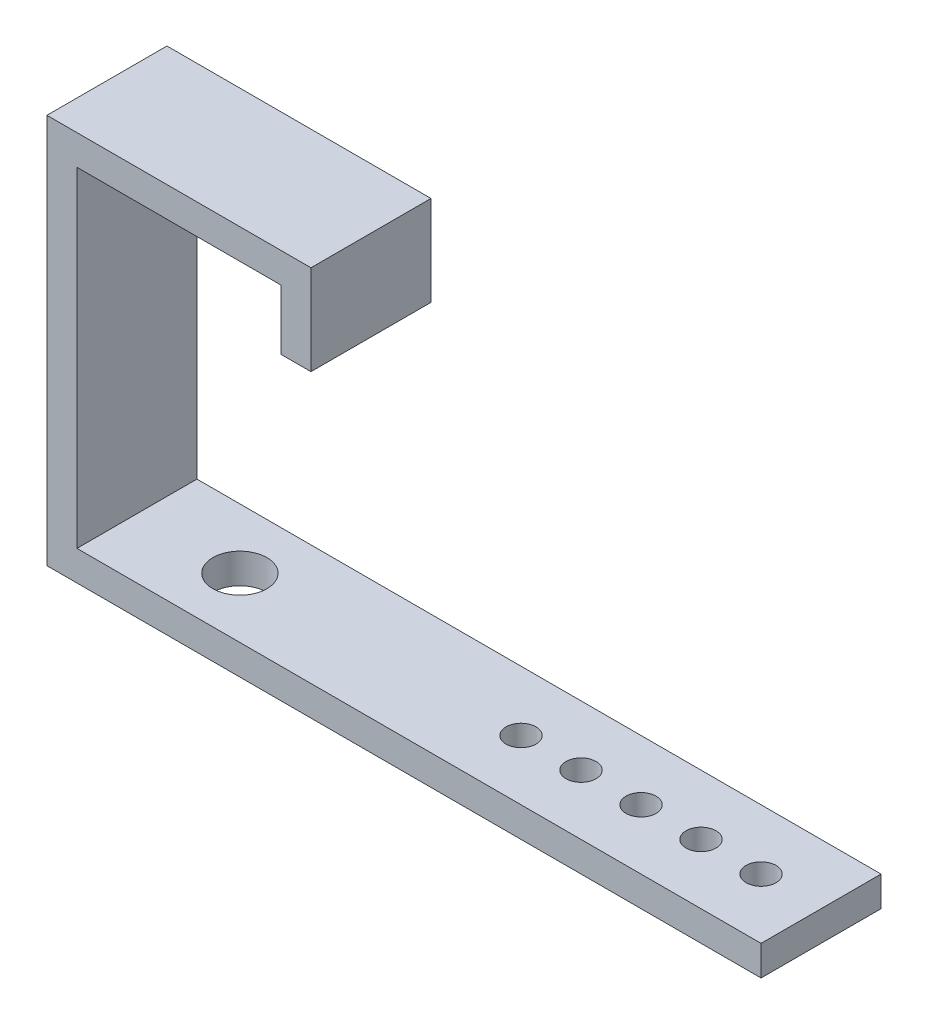
ISO-10303-21;
HEADER;
FILE_DESCRIPTION(('STEP AP214'),'2;1');
FILE_NAME('part.step','',(''),(''),'','','');
FILE_SCHEMA(('AUTOMOTIVE_DESIGN { 1 0 10303 214 1 1 1 1 }'));
ENDSEC;
DATA;
#1=APPLICATION_CONTEXT('core data for automotive mechanical design processes');
#2=APPLICATION_PROTOCOL_DEFINITION('international standard','automotive_design',2000,#1);
#3=PRODUCT_CONTEXT('',#1,'mechanical');
#4=PRODUCT('Part','Part','',(#3));
#5=PRODUCT_RELATED_PRODUCT_CATEGORY('part','',(#4));
#6=PRODUCT_DEFINITION_FORMATION('','',#4);
#7=PRODUCT_DEFINITION_CONTEXT('part definition',#1,'design');
#8=PRODUCT_DEFINITION('design','',#6,#7);
#9=PRODUCT_DEFINITION_SHAPE('','',#8);
#10=(LENGTH_UNIT() NAMED_UNIT(*) SI_UNIT(.MILLI.,.METRE.));
#11=(NAMED_UNIT(*) PLANE_ANGLE_UNIT() SI_UNIT($,.RADIAN.));
#12=(NAMED_UNIT(*) SI_UNIT($,.STERADIAN.) SOLID_ANGLE_UNIT());
#13=UNCERTAINTY_MEASURE_WITH_UNIT(LENGTH_MEASURE(1.E-05),#10,'distance_accuracy_value','');
#14=(GEOMETRIC_REPRESENTATION_CONTEXT(3) GLOBAL_UNCERTAINTY_ASSIGNED_CONTEXT((#13)) GLOBAL_UNIT_ASSIGNED_CONTEXT((#10,
#11,#12)) REPRESENTATION_CONTEXT('',''));
#15=CARTESIAN_POINT('',(0.,0.,0.));
#16=DIRECTION('',(0.,0.,1.));
#17=DIRECTION('',(1.,0.,0.));
#18=AXIS2_PLACEMENT_3D('',#15,#16,#17);
#19=CARTESIAN_POINT('',(0.,25.1525882715006,20.));
#20=DIRECTION('',(0.,-1.,0.));
#21=DIRECTION('',(1.,0.,0.));
#22=AXIS2_PLACEMENT_3D('',#19,#20,#21);
#23=PLANE('',#22);
#24=DIRECTION('',(-1.,0.,0.));
#25=VECTOR('',#24,1.);
#26=CARTESIAN_POINT('',(0.,25.1525882715006,0.));
#27=LINE('',#26,#25);
#28=CARTESIAN_POINT('',(17.6256228738895,25.1525882715006,0.));
#29=VERTEX_POINT('',#28);
#30=CARTESIAN_POINT('',(-26.3743771261105,25.1525882715006,0.));
#31=VERTEX_POINT('',#30);
#32=EDGE_CURVE('E133',#29,#31,#27,.T.);
#33=ORIENTED_EDGE('',*,*,#32,.T.);
#34=DIRECTION('',(0.,0.,-1.));
#35=VECTOR('',#34,1.);
#36=CARTESIAN_POINT('',(-26.3743771261105,25.1525882715006,20.));
#37=LINE('',#36,#35);
#38=CARTESIAN_POINT('',(-26.3743771261105,25.1525882715006,20.));
#39=VERTEX_POINT('',#38);
#40=EDGE_CURVE('E11',#39,#31,#37,.T.);
#41=ORIENTED_EDGE('',*,*,#40,.F.);
#42=DIRECTION('',(-1.,0.,0.));
#43=VECTOR('',#42,1.);
#44=CARTESIAN_POINT('',(0.,25.1525882715006,20.));
#45=LINE('',#44,#43);
#46=CARTESIAN_POINT('',(17.6256228738895,25.1525882715006,20.));
#47=VERTEX_POINT('',#46);
#48=EDGE_CURVE('E156',#47,#39,#45,.T.);
#49=ORIENTED_EDGE('',*,*,#48,.F.);
#50=DIRECTION('',(0.,0.,-1.));
#51=VECTOR('',#50,1.);
#52=CARTESIAN_POINT('',(17.6256228738895,25.1525882715006,20.));
#53=LINE('',#52,#51);
#54=EDGE_CURVE('E49',#47,#29,#53,.T.);
#55=ORIENTED_EDGE('',*,*,#54,.T.);
#56=EDGE_LOOP('',(#33,#41,#49,#55));
#57=FACE_BOUND('',#56,.T.);
#58=ADVANCED_FACE('F33',(#57),#23,.F.);
#59=CARTESIAN_POINT('',(-26.3743771261105,0.,20.));
#60=DIRECTION('',(1.,0.,0.));
#61=DIRECTION('',(0.,1.,0.));
#62=AXIS2_PLACEMENT_3D('',#59,#60,#61);
#63=PLANE('',#62);
#64=DIRECTION('',(0.,-1.,0.));
#65=VECTOR('',#64,1.);
#66=CARTESIAN_POINT('',(-26.3743771261105,0.,0.));
#67=LINE('',#66,#65);
#68=CARTESIAN_POINT('',(-26.3743771261105,-39.8474117284994,0.));
#69=VERTEX_POINT('',#68);
#70=EDGE_CURVE('E135',#31,#69,#67,.T.);
#71=ORIENTED_EDGE('',*,*,#70,.T.);
#72=DIRECTION('',(0.,0.,-1.));
#73=VECTOR('',#72,1.);
#74=CARTESIAN_POINT('',(-26.3743771261105,-39.8474117284994,20.));
#75=LINE('',#74,#73);
#76=CARTESIAN_POINT('',(-26.3743771261105,-39.8474117284994,20.));
#77=VERTEX_POINT('',#76);
#78=EDGE_CURVE('E41',#77,#69,#75,.T.);
#79=ORIENTED_EDGE('',*,*,#78,.F.);
#80=DIRECTION('',(0.,-1.,0.));
#81=VECTOR('',#80,1.);
#82=CARTESIAN_POINT('',(-26.3743771261105,0.,20.));
#83=LINE('',#82,#81);
#84=EDGE_CURVE('E89',#39,#77,#83,.T.);
#85=ORIENTED_EDGE('',*,*,#84,.F.);
#86=ORIENTED_EDGE('',*,*,#40,.T.);
#87=EDGE_LOOP('',(#71,#79,#85,#86));
#88=FACE_BOUND('',#87,.T.);
#89=ADVANCED_FACE('F221',(#88),#63,.F.);
#90=CARTESIAN_POINT('',(0.,-39.8474117284994,20.));
#91=DIRECTION('',(0.,1.,0.));
#92=DIRECTION('',(-1.,0.,0.));
#93=AXIS2_PLACEMENT_3D('',#90,#91,#92);
#94=PLANE('',#93);
#95=CARTESIAN_POINT('',(42.6256228738895,-39.8474117284994,9.99999999999972));
#96=DIRECTION('',(0.,-1.,0.));
#97=DIRECTION('',(1.,0.,0.));
#98=AXIS2_PLACEMENT_3D('',#95,#96,#97);
#99=CIRCLE('',#98,2.5);
#100=CARTESIAN_POINT('',(45.1256228738895,-39.8474117284994,9.99999999999972));
#101=VERTEX_POINT('',#100);
#102=EDGE_CURVE('E259',#101,#101,#99,.T.);
#103=ORIENTED_EDGE('',*,*,#102,.F.);
#104=EDGE_LOOP('',(#103));
#105=FACE_BOUND('',#104,.T.);
#106=CARTESIAN_POINT('',(52.6256228738895,-39.8474117284994,9.99999999999979));
#107=DIRECTION('',(0.,-1.,0.));
#108=DIRECTION('',(1.,0.,0.));
#109=AXIS2_PLACEMENT_3D('',#106,#107,#108);
#110=CIRCLE('',#109,2.5);
#111=CARTESIAN_POINT('',(55.1256228738895,-39.8474117284994,9.99999999999979));
#112=VERTEX_POINT('',#111);
#113=EDGE_CURVE('E253',#112,#112,#110,.T.);
#114=ORIENTED_EDGE('',*,*,#113,.F.);
#115=EDGE_LOOP('',(#114));
#116=FACE_BOUND('',#115,.T.);
#117=CARTESIAN_POINT('',(62.6256228738895,-39.8474117284994,9.99999999999986));
#118=DIRECTION('',(0.,-1.,0.));
#119=DIRECTION('',(1.,0.,0.));
#120=AXIS2_PLACEMENT_3D('',#117,#118,#119);
#121=CIRCLE('',#120,2.5);
#122=CARTESIAN_POINT('',(65.1256228738895,-39.8474117284994,9.99999999999986));
#123=VERTEX_POINT('',#122);
#124=EDGE_CURVE('E247',#123,#123,#121,.T.);
#125=ORIENTED_EDGE('',*,*,#124,.F.);
#126=EDGE_LOOP('',(#125));
#127=FACE_BOUND('',#126,.T.);
#128=CARTESIAN_POINT('',(72.6256228738895,-39.8474117284994,9.99999999999993));
#129=DIRECTION('',(0.,-1.,0.));
#130=DIRECTION('',(1.,0.,0.));
#131=AXIS2_PLACEMENT_3D('',#128,#129,#130);
#132=CIRCLE('',#131,2.5);
#133=CARTESIAN_POINT('',(75.1256228738895,-39.8474117284994,9.99999999999993));
#134=VERTEX_POINT('',#133);
#135=EDGE_CURVE('E241',#134,#134,#132,.T.);
#136=ORIENTED_EDGE('',*,*,#135,.F.);
#137=EDGE_LOOP('',(#136));
#138=FACE_BOUND('',#137,.T.);
#139=CARTESIAN_POINT('',(82.6256228738895,-39.8474117284994,10.));
#140=DIRECTION('',(0.,-1.,0.));
#141=DIRECTION('',(1.,0.,0.));
#142=AXIS2_PLACEMENT_3D('',#139,#140,#141);
#143=CIRCLE('',#142,2.5);
#144=CARTESIAN_POINT('',(85.1256228738895,-39.8474117284994,10.));
#145=VERTEX_POINT('',#144);
#146=EDGE_CURVE('E233',#145,#145,#143,.T.);
#147=ORIENTED_EDGE('',*,*,#146,.F.);
#148=EDGE_LOOP('',(#147));
#149=FACE_BOUND('',#148,.T.);
#150=CARTESIAN_POINT('',(-4.21985927237253,-39.8474117284994,10.));
#151=DIRECTION('',(0.,-1.,0.));
#152=DIRECTION('',(1.,0.,0.));
#153=AXIS2_PLACEMENT_3D('',#150,#151,#152);
#154=CIRCLE('',#153,4.5);
#155=CARTESIAN_POINT('',(0.280140727627472,-39.8474117284994,10.));
#156=VERTEX_POINT('',#155);
#157=EDGE_CURVE('E188',#156,#156,#154,.T.);
#158=ORIENTED_EDGE('',*,*,#157,.F.);
#159=EDGE_LOOP('',(#158));
#160=FACE_BOUND('',#159,.T.);
#161=DIRECTION('',(1.,0.,0.));
#162=VECTOR('',#161,1.);
#163=CARTESIAN_POINT('',(0.,-39.8474117284994,0.));
#164=LINE('',#163,#162);
#165=CARTESIAN_POINT('',(92.6256228738895,-39.8474117284994,0.));
#166=VERTEX_POINT('',#165);
#167=EDGE_CURVE('E138',#69,#166,#164,.T.);
#168=ORIENTED_EDGE('',*,*,#167,.T.);
#169=DIRECTION('',(0.,0.,-1.));
#170=VECTOR('',#169,1.);
#171=CARTESIAN_POINT('',(92.6256228738895,-39.8474117284994,20.));
#172=LINE('',#171,#170);
#173=CARTESIAN_POINT('',(92.6256228738895,-39.8474117284994,20.));
#174=VERTEX_POINT('',#173);
#175=EDGE_CURVE('E186',#174,#166,#172,.T.);
#176=ORIENTED_EDGE('',*,*,#175,.F.);
#177=DIRECTION('',(1.,0.,0.));
#178=VECTOR('',#177,1.);
#179=CARTESIAN_POINT('',(0.,-39.8474117284994,20.));
#180=LINE('',#179,#178);
#181=EDGE_CURVE('E172',#77,#174,#180,.T.);
#182=ORIENTED_EDGE('',*,*,#181,.F.);
#183=ORIENTED_EDGE('',*,*,#78,.T.);
#184=EDGE_LOOP('',(#168,#176,#182,#183));
#185=FACE_BOUND('',#184,.T.);
#186=ADVANCED_FACE('F167',(#105,#116,#127,#138,#149,#160,#185),#94,.F.);
#187=CARTESIAN_POINT('',(0.,-34.8474117284994,20.));
#188=DIRECTION('',(0.,1.,0.));
#189=DIRECTION('',(0.,0.,1.));
#190=AXIS2_PLACEMENT_3D('',#187,#188,#189);
#191=PLANE('',#190);
#192=CARTESIAN_POINT('',(42.6256228738895,-34.8474117284994,9.99999999999972));
#193=DIRECTION('',(0.,1.,0.));
#194=DIRECTION('',(0.,0.,1.));
#195=AXIS2_PLACEMENT_3D('',#192,#193,#194);
#196=CIRCLE('',#195,2.5);
#197=CARTESIAN_POINT('',(42.6256228738895,-34.8474117284994,12.4999999999997));
#198=VERTEX_POINT('',#197);
#199=EDGE_CURVE('E256',#198,#198,#196,.F.);
#200=ORIENTED_EDGE('',*,*,#199,.T.);
#201=EDGE_LOOP('',(#200));
#202=FACE_BOUND('',#201,.T.);
#203=CARTESIAN_POINT('',(52.6256228738895,-34.8474117284994,9.99999999999979));
#204=DIRECTION('',(0.,1.,0.));
#205=DIRECTION('',(0.,0.,1.));
#206=AXIS2_PLACEMENT_3D('',#203,#204,#205);
#207=CIRCLE('',#206,2.5);
#208=CARTESIAN_POINT('',(52.6256228738895,-34.8474117284994,12.4999999999998));
#209=VERTEX_POINT('',#208);
#210=EDGE_CURVE('E250',#209,#209,#207,.F.);
#211=ORIENTED_EDGE('',*,*,#210,.T.);
#212=EDGE_LOOP('',(#211));
#213=FACE_BOUND('',#212,.T.);
#214=CARTESIAN_POINT('',(62.6256228738895,-34.8474117284994,9.99999999999986));
#215=DIRECTION('',(0.,1.,0.));
#216=DIRECTION('',(0.,0.,1.));
#217=AXIS2_PLACEMENT_3D('',#214,#215,#216);
#218=CIRCLE('',#217,2.5);
#219=CARTESIAN_POINT('',(62.6256228738895,-34.8474117284994,12.4999999999999));
#220=VERTEX_POINT('',#219);
#221=EDGE_CURVE('E244',#220,#220,#218,.F.);
#222=ORIENTED_EDGE('',*,*,#221,.T.);
#223=EDGE_LOOP('',(#222));
#224=FACE_BOUND('',#223,.T.);
#225=CARTESIAN_POINT('',(72.6256228738895,-34.8474117284994,9.99999999999993));
#226=DIRECTION('',(0.,1.,0.));
#227=DIRECTION('',(0.,0.,1.));
#228=AXIS2_PLACEMENT_3D('',#225,#226,#227);
#229=CIRCLE('',#228,2.5);
#230=CARTESIAN_POINT('',(72.6256228738895,-34.8474117284994,12.4999999999999));
#231=VERTEX_POINT('',#230);
#232=EDGE_CURVE('E238',#231,#231,#229,.F.);
#233=ORIENTED_EDGE('',*,*,#232,.T.);
#234=EDGE_LOOP('',(#233));
#235=FACE_BOUND('',#234,.T.);
#236=CARTESIAN_POINT('',(82.6256228738895,-34.8474117284994,10.));
#237=DIRECTION('',(0.,1.,0.));
#238=DIRECTION('',(0.,0.,1.));
#239=AXIS2_PLACEMENT_3D('',#236,#237,#238);
#240=CIRCLE('',#239,2.5);
#241=CARTESIAN_POINT('',(82.6256228738895,-34.8474117284994,12.5));
#242=VERTEX_POINT('',#241);
#243=EDGE_CURVE('E231',#242,#242,#240,.F.);
#244=ORIENTED_EDGE('',*,*,#243,.T.);
#245=EDGE_LOOP('',(#244));
#246=FACE_BOUND('',#245,.T.);
#247=CARTESIAN_POINT('',(-4.21985927237253,-34.8474117284994,10.));
#248=DIRECTION('',(0.,1.,0.));
#249=DIRECTION('',(0.,0.,1.));
#250=AXIS2_PLACEMENT_3D('',#247,#248,#249);
#251=CIRCLE('',#250,4.5);
#252=CARTESIAN_POINT('',(-4.21985927237253,-34.8474117284994,14.5));
#253=VERTEX_POINT('',#252);
#254=EDGE_CURVE('E136',#253,#253,#251,.F.);
#255=ORIENTED_EDGE('',*,*,#254,.T.);
#256=EDGE_LOOP('',(#255));
#257=FACE_BOUND('',#256,.T.);
#258=DIRECTION('',(1.,0.,0.));
#259=VECTOR('',#258,1.);
#260=CARTESIAN_POINT('',(0.,-34.8474117284994,0.));
#261=LINE('',#260,#259);
#262=CARTESIAN_POINT('',(-21.3743771261105,-34.8474117284994,0.));
#263=VERTEX_POINT('',#262);
#264=CARTESIAN_POINT('',(92.6256228738895,-34.8474117284994,0.));
#265=VERTEX_POINT('',#264);
#266=EDGE_CURVE('E141',#263,#265,#261,.T.);
#267=ORIENTED_EDGE('',*,*,#266,.F.);
#268=DIRECTION('',(0.,0.,-1.));
#269=VECTOR('',#268,1.);
#270=CARTESIAN_POINT('',(-21.3743771261105,-34.8474117284994,20.));
#271=LINE('',#270,#269);
#272=CARTESIAN_POINT('',(-21.3743771261105,-34.8474117284994,20.));
#273=VERTEX_POINT('',#272);
#274=EDGE_CURVE('E162',#273,#263,#271,.T.);
#275=ORIENTED_EDGE('',*,*,#274,.F.);
#276=DIRECTION('',(1.,0.,0.));
#277=VECTOR('',#276,1.);
#278=CARTESIAN_POINT('',(0.,-34.8474117284994,20.));
#279=LINE('',#278,#277);
#280=CARTESIAN_POINT('',(92.6256228738895,-34.8474117284994,20.));
#281=VERTEX_POINT('',#280);
#282=EDGE_CURVE('E201',#273,#281,#279,.T.);
#283=ORIENTED_EDGE('',*,*,#282,.T.);
#284=DIRECTION('',(0.,0.,1.));
#285=VECTOR('',#284,1.);
#286=CARTESIAN_POINT('',(92.6256228738895,-34.8474117284994,20.));
#287=LINE('',#286,#285);
#288=EDGE_CURVE('E185',#265,#281,#287,.T.);
#289=ORIENTED_EDGE('',*,*,#288,.F.);
#290=EDGE_LOOP('',(#267,#275,#283,#289));
#291=FACE_BOUND('',#290,.T.);
#292=ADVANCED_FACE('F268',(#202,#213,#224,#235,#246,#257,#291),#191,.T.);
#293=CARTESIAN_POINT('',(-21.3743771261105,0.,20.));
#294=DIRECTION('',(1.,0.,0.));
#295=DIRECTION('',(0.,1.,0.));
#296=AXIS2_PLACEMENT_3D('',#293,#294,#295);
#297=PLANE('',#296);
#298=DIRECTION('',(0.,-1.,0.));
#299=VECTOR('',#298,1.);
#300=CARTESIAN_POINT('',(-21.3743771261105,0.,0.));
#301=LINE('',#300,#299);
#302=CARTESIAN_POINT('',(-21.3743771261105,20.1525882715006,0.));
#303=VERTEX_POINT('',#302);
#304=EDGE_CURVE('E144',#303,#263,#301,.T.);
#305=ORIENTED_EDGE('',*,*,#304,.F.);
#306=DIRECTION('',(0.,0.,-1.));
#307=VECTOR('',#306,1.);
#308=CARTESIAN_POINT('',(-21.3743771261105,20.1525882715006,20.));
#309=LINE('',#308,#307);
#310=CARTESIAN_POINT('',(-21.3743771261105,20.1525882715006,20.));
#311=VERTEX_POINT('',#310);
#312=EDGE_CURVE('E160',#311,#303,#309,.T.);
#313=ORIENTED_EDGE('',*,*,#312,.F.);
#314=DIRECTION('',(0.,-1.,0.));
#315=VECTOR('',#314,1.);
#316=CARTESIAN_POINT('',(-21.3743771261105,0.,20.));
#317=LINE('',#316,#315);
#318=EDGE_CURVE('E204',#311,#273,#317,.T.);
#319=ORIENTED_EDGE('',*,*,#318,.T.);
#320=ORIENTED_EDGE('',*,*,#274,.T.);
#321=EDGE_LOOP('',(#305,#313,#319,#320));
#322=FACE_BOUND('',#321,.T.);
#323=ADVANCED_FACE('F288',(#322),#297,.T.);
#324=CARTESIAN_POINT('',(0.,20.1525882715006,20.));
#325=DIRECTION('',(0.,-1.,0.));
#326=DIRECTION('',(1.,0.,0.));
#327=AXIS2_PLACEMENT_3D('',#324,#325,#326);
#328=PLANE('',#327);
#329=DIRECTION('',(-1.,0.,0.));
#330=VECTOR('',#329,1.);
#331=CARTESIAN_POINT('',(0.,20.1525882715006,0.));
#332=LINE('',#331,#330);
#333=CARTESIAN_POINT('',(12.6256228738895,20.1525882715006,0.));
#334=VERTEX_POINT('',#333);
#335=EDGE_CURVE('E147',#334,#303,#332,.T.);
#336=ORIENTED_EDGE('',*,*,#335,.F.);
#337=DIRECTION('',(0.,0.,-1.));
#338=VECTOR('',#337,1.);
#339=CARTESIAN_POINT('',(12.6256228738895,20.1525882715006,20.));
#340=LINE('',#339,#338);
#341=CARTESIAN_POINT('',(12.6256228738895,20.1525882715006,20.));
#342=VERTEX_POINT('',#341);
#343=EDGE_CURVE('E125',#342,#334,#340,.T.);
#344=ORIENTED_EDGE('',*,*,#343,.F.);
#345=DIRECTION('',(-1.,0.,0.));
#346=VECTOR('',#345,1.);
#347=CARTESIAN_POINT('',(0.,20.1525882715006,20.));
#348=LINE('',#347,#346);
#349=EDGE_CURVE('E115',#342,#311,#348,.T.);
#350=ORIENTED_EDGE('',*,*,#349,.T.);
#351=ORIENTED_EDGE('',*,*,#312,.T.);
#352=EDGE_LOOP('',(#336,#344,#350,#351));
#353=FACE_BOUND('',#352,.T.);
#354=ADVANCED_FACE('F208',(#353),#328,.T.);
#355=CARTESIAN_POINT('',(12.6256228738895,0.,20.));
#356=DIRECTION('',(1.,0.,0.));
#357=DIRECTION('',(0.,0.,-1.));
#358=AXIS2_PLACEMENT_3D('',#355,#356,#357);
#359=PLANE('',#358);
#360=DIRECTION('',(0.,-1.,0.));
#361=VECTOR('',#360,1.);
#362=CARTESIAN_POINT('',(12.6256228738895,0.,0.));
#363=LINE('',#362,#361);
#364=CARTESIAN_POINT('',(12.6256228738895,10.1525882715006,0.));
#365=VERTEX_POINT('',#364);
#366=EDGE_CURVE('E122',#334,#365,#363,.T.);
#367=ORIENTED_EDGE('',*,*,#366,.T.);
#368=DIRECTION('',(0.,0.,-1.));
#369=VECTOR('',#368,1.);
#370=CARTESIAN_POINT('',(12.6256228738895,10.1525882715006,20.));
#371=LINE('',#370,#369);
#372=CARTESIAN_POINT('',(12.6256228738895,10.1525882715006,20.));
#373=VERTEX_POINT('',#372);
#374=EDGE_CURVE('E119',#373,#365,#371,.T.);
#375=ORIENTED_EDGE('',*,*,#374,.F.);
#376=DIRECTION('',(0.,-1.,0.));
#377=VECTOR('',#376,1.);
#378=CARTESIAN_POINT('',(12.6256228738895,0.,20.));
#379=LINE('',#378,#377);
#380=EDGE_CURVE('E107',#342,#373,#379,.T.);
#381=ORIENTED_EDGE('',*,*,#380,.F.);
#382=ORIENTED_EDGE('',*,*,#343,.T.);
#383=EDGE_LOOP('',(#367,#375,#381,#382));
#384=FACE_BOUND('',#383,.T.);
#385=ADVANCED_FACE('F120',(#384),#359,.F.);
#386=CARTESIAN_POINT('',(0.,10.1525882715006,20.));
#387=DIRECTION('',(0.,1.,0.));
#388=DIRECTION('',(0.,0.,1.));
#389=AXIS2_PLACEMENT_3D('',#386,#387,#388);
#390=PLANE('',#389);
#391=DIRECTION('',(1.,0.,0.));
#392=VECTOR('',#391,1.);
#393=CARTESIAN_POINT('',(0.,10.1525882715006,0.));
#394=LINE('',#393,#392);
#395=CARTESIAN_POINT('',(17.6256228738895,10.1525882715006,0.));
#396=VERTEX_POINT('',#395);
#397=EDGE_CURVE('E151',#365,#396,#394,.T.);
#398=ORIENTED_EDGE('',*,*,#397,.T.);
#399=DIRECTION('',(0.,0.,-1.));
#400=VECTOR('',#399,1.);
#401=CARTESIAN_POINT('',(17.6256228738895,10.1525882715006,20.));
#402=LINE('',#401,#400);
#403=CARTESIAN_POINT('',(17.6256228738895,10.1525882715006,20.));
#404=VERTEX_POINT('',#403);
#405=EDGE_CURVE('E77',#404,#396,#402,.T.);
#406=ORIENTED_EDGE('',*,*,#405,.F.);
#407=DIRECTION('',(1.,0.,0.));
#408=VECTOR('',#407,1.);
#409=CARTESIAN_POINT('',(0.,10.1525882715006,20.));
#410=LINE('',#409,#408);
#411=EDGE_CURVE('E112',#373,#404,#410,.T.);
#412=ORIENTED_EDGE('',*,*,#411,.F.);
#413=ORIENTED_EDGE('',*,*,#374,.T.);
#414=EDGE_LOOP('',(#398,#406,#412,#413));
#415=FACE_BOUND('',#414,.T.);
#416=ADVANCED_FACE('F127',(#415),#390,.F.);
#417=CARTESIAN_POINT('',(17.6256228738895,0.,20.));
#418=DIRECTION('',(1.,0.,0.));
#419=DIRECTION('',(0.,1.,0.));
#420=AXIS2_PLACEMENT_3D('',#417,#418,#419);
#421=PLANE('',#420);
#422=DIRECTION('',(0.,-1.,0.));
#423=VECTOR('',#422,1.);
#424=CARTESIAN_POINT('',(17.6256228738895,0.,0.));
#425=LINE('',#424,#423);
#426=EDGE_CURVE('E153',#29,#396,#425,.T.);
#427=ORIENTED_EDGE('',*,*,#426,.F.);
#428=ORIENTED_EDGE('',*,*,#54,.F.);
#429=DIRECTION('',(0.,-1.,0.));
#430=VECTOR('',#429,1.);
#431=CARTESIAN_POINT('',(17.6256228738895,0.,20.));
#432=LINE('',#431,#430);
#433=EDGE_CURVE('E128',#47,#404,#432,.T.);
#434=ORIENTED_EDGE('',*,*,#433,.T.);
#435=ORIENTED_EDGE('',*,*,#405,.T.);
#436=EDGE_LOOP('',(#427,#428,#434,#435));
#437=FACE_BOUND('',#436,.T.);
#438=ADVANCED_FACE('F210',(#437),#421,.T.);
#439=CARTESIAN_POINT('',(0.,0.,20.));
#440=DIRECTION('',(0.,0.,1.));
#441=DIRECTION('',(1.,0.,0.));
#442=AXIS2_PLACEMENT_3D('',#439,#440,#441);
#443=PLANE('',#442);
#444=ORIENTED_EDGE('',*,*,#48,.T.);
#445=ORIENTED_EDGE('',*,*,#84,.T.);
#446=ORIENTED_EDGE('',*,*,#181,.T.);
#447=DIRECTION('',(0.,-1.,0.));
#448=VECTOR('',#447,1.);
#449=CARTESIAN_POINT('',(92.6256228738895,-34.8474117284994,20.));
#450=LINE('',#449,#448);
#451=EDGE_CURVE('E190',#281,#174,#450,.T.);
#452=ORIENTED_EDGE('',*,*,#451,.F.);
#453=ORIENTED_EDGE('',*,*,#282,.F.);
#454=ORIENTED_EDGE('',*,*,#318,.F.);
#455=ORIENTED_EDGE('',*,*,#349,.F.);
#456=ORIENTED_EDGE('',*,*,#380,.T.);
#457=ORIENTED_EDGE('',*,*,#411,.T.);
#458=ORIENTED_EDGE('',*,*,#433,.F.);
#459=EDGE_LOOP('',(#444,#445,#446,#452,#453,#454,#455,#456,#457,#458));
#460=FACE_BOUND('',#459,.T.);
#461=ADVANCED_FACE('F109',(#460),#443,.T.);
#462=CARTESIAN_POINT('',(0.,0.,0.));
#463=DIRECTION('',(0.,0.,1.));
#464=DIRECTION('',(1.,0.,0.));
#465=AXIS2_PLACEMENT_3D('',#462,#463,#464);
#466=PLANE('',#465);
#467=ORIENTED_EDGE('',*,*,#32,.F.);
#468=ORIENTED_EDGE('',*,*,#426,.T.);
#469=ORIENTED_EDGE('',*,*,#397,.F.);
#470=ORIENTED_EDGE('',*,*,#366,.F.);
#471=ORIENTED_EDGE('',*,*,#335,.T.);
#472=ORIENTED_EDGE('',*,*,#304,.T.);
#473=ORIENTED_EDGE('',*,*,#266,.T.);
#474=DIRECTION('',(0.,1.,0.));
#475=VECTOR('',#474,1.);
#476=CARTESIAN_POINT('',(92.6256228738895,-34.8474117284994,0.));
#477=LINE('',#476,#475);
#478=EDGE_CURVE('E177',#166,#265,#477,.T.);
#479=ORIENTED_EDGE('',*,*,#478,.F.);
#480=ORIENTED_EDGE('',*,*,#167,.F.);
#481=ORIENTED_EDGE('',*,*,#70,.F.);
#482=EDGE_LOOP('',(#467,#468,#469,#470,#471,#472,#473,#479,#480,#481));
#483=FACE_BOUND('',#482,.T.);
#484=ADVANCED_FACE('F175',(#483),#466,.F.);
#485=CARTESIAN_POINT('',(-4.21985927237253,-22.1194896671415,10.));
#486=DIRECTION('',(0.,-1.,0.));
#487=DIRECTION('',(1.,0.,0.));
#488=AXIS2_PLACEMENT_3D('',#485,#486,#487);
#489=CYLINDRICAL_SURFACE('',#488,4.5);
#490=ORIENTED_EDGE('',*,*,#157,.T.);
#491=EDGE_LOOP('',(#490));
#492=FACE_BOUND('',#491,.T.);
#493=ORIENTED_EDGE('',*,*,#254,.F.);
#494=EDGE_LOOP('',(#493));
#495=FACE_BOUND('',#494,.T.);
#496=ADVANCED_FACE('F280',(#492,#495),#489,.F.);
#497=CARTESIAN_POINT('',(92.6256228738895,0.,0.));
#498=DIRECTION('',(1.,0.,0.));
#499=DIRECTION('',(0.,0.,-1.));
#500=AXIS2_PLACEMENT_3D('',#497,#498,#499);
#501=PLANE('',#500);
#502=ORIENTED_EDGE('',*,*,#451,.T.);
#503=ORIENTED_EDGE('',*,*,#175,.T.);
#504=ORIENTED_EDGE('',*,*,#478,.T.);
#505=ORIENTED_EDGE('',*,*,#288,.T.);
#506=EDGE_LOOP('',(#502,#503,#504,#505));
#507=FACE_BOUND('',#506,.T.);
#508=ADVANCED_FACE('F230',(#507),#501,.T.);
#509=CARTESIAN_POINT('',(82.6256228738895,-27.7763439166339,10.));
#510=DIRECTION('',(0.,-1.,0.));
#511=DIRECTION('',(1.,0.,0.));
#512=AXIS2_PLACEMENT_3D('',#509,#510,#511);
#513=CYLINDRICAL_SURFACE('',#512,2.5);
#514=ORIENTED_EDGE('',*,*,#146,.T.);
#515=EDGE_LOOP('',(#514));
#516=FACE_BOUND('',#515,.T.);
#517=ORIENTED_EDGE('',*,*,#243,.F.);
#518=EDGE_LOOP('',(#517));
#519=FACE_BOUND('',#518,.T.);
#520=ADVANCED_FACE('F345',(#516,#519),#513,.F.);
#521=CARTESIAN_POINT('',(72.6256228738895,-27.7763439166339,9.99999999999993));
#522=DIRECTION('',(0.,-1.,0.));
#523=DIRECTION('',(1.,0.,0.));
#524=AXIS2_PLACEMENT_3D('',#521,#522,#523);
#525=CYLINDRICAL_SURFACE('',#524,2.5);
#526=ORIENTED_EDGE('',*,*,#135,.T.);
#527=EDGE_LOOP('',(#526));
#528=FACE_BOUND('',#527,.T.);
#529=ORIENTED_EDGE('',*,*,#232,.F.);
#530=EDGE_LOOP('',(#529));
#531=FACE_BOUND('',#530,.T.);
#532=ADVANCED_FACE('F366',(#528,#531),#525,.F.);
#533=CARTESIAN_POINT('',(62.6256228738895,-27.7763439166339,9.99999999999986));
#534=DIRECTION('',(0.,-1.,0.));
#535=DIRECTION('',(1.,0.,0.));
#536=AXIS2_PLACEMENT_3D('',#533,#534,#535);
#537=CYLINDRICAL_SURFACE('',#536,2.5);
#538=ORIENTED_EDGE('',*,*,#124,.T.);
#539=EDGE_LOOP('',(#538));
#540=FACE_BOUND('',#539,.T.);
#541=ORIENTED_EDGE('',*,*,#221,.F.);
#542=EDGE_LOOP('',(#541));
#543=FACE_BOUND('',#542,.T.);
#544=ADVANCED_FACE('F376',(#540,#543),#537,.F.);
#545=CARTESIAN_POINT('',(52.6256228738895,-27.7763439166339,9.99999999999979));
#546=DIRECTION('',(0.,-1.,0.));
#547=DIRECTION('',(1.,0.,0.));
#548=AXIS2_PLACEMENT_3D('',#545,#546,#547);
#549=CYLINDRICAL_SURFACE('',#548,2.5);
#550=ORIENTED_EDGE('',*,*,#113,.T.);
#551=EDGE_LOOP('',(#550));
#552=FACE_BOUND('',#551,.T.);
#553=ORIENTED_EDGE('',*,*,#210,.F.);
#554=EDGE_LOOP('',(#553));
#555=FACE_BOUND('',#554,.T.);
#556=ADVANCED_FACE('F386',(#552,#555),#549,.F.);
#557=CARTESIAN_POINT('',(42.6256228738895,-27.7763439166339,9.99999999999972));
#558=DIRECTION('',(0.,-1.,0.));
#559=DIRECTION('',(1.,0.,0.));
#560=AXIS2_PLACEMENT_3D('',#557,#558,#559);
#561=CYLINDRICAL_SURFACE('',#560,2.5);
#562=ORIENTED_EDGE('',*,*,#102,.T.);
#563=EDGE_LOOP('',(#562));
#564=FACE_BOUND('',#563,.T.);
#565=ORIENTED_EDGE('',*,*,#199,.F.);
#566=EDGE_LOOP('',(#565));
#567=FACE_BOUND('',#566,.T.);
#568=ADVANCED_FACE('F263',(#564,#567),#561,.F.);
#569=CLOSED_SHELL('',(#58,#89,#186,#292,#323,#354,#385,#416,#438,#461,#484,#496,#508,#520,#532,
#544,#556,#568));
#570=MANIFOLD_SOLID_BREP('B2',#569);
#571=ADVANCED_BREP_SHAPE_REPRESENTATION('',(#18,#570),#14);
#572=SHAPE_DEFINITION_REPRESENTATION(#9,#571);
ENDSEC;
END-ISO-10303-21;
